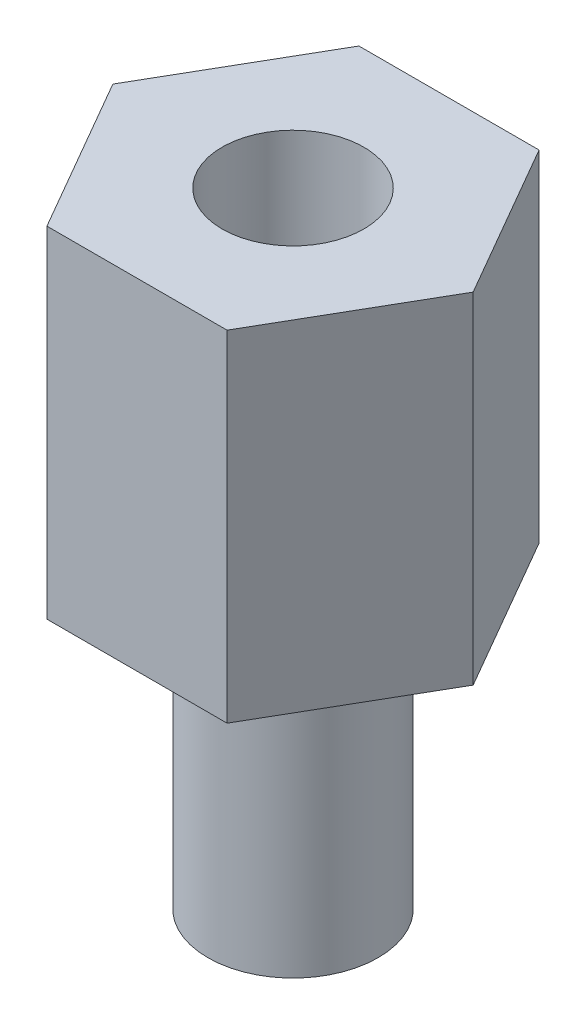
ISO-10303-21;
HEADER;
FILE_DESCRIPTION(('STEP AP214'),'2;1');
FILE_NAME('part.step','',(''),(''),'','','');
FILE_SCHEMA(('AUTOMOTIVE_DESIGN { 1 0 10303 214 1 1 1 1 }'));
ENDSEC;
DATA;
#1=APPLICATION_CONTEXT('core data for automotive mechanical design processes');
#2=APPLICATION_PROTOCOL_DEFINITION('international standard','automotive_design',2000,#1);
#3=PRODUCT_CONTEXT('',#1,'mechanical');
#4=PRODUCT('Part','Part','',(#3));
#5=PRODUCT_RELATED_PRODUCT_CATEGORY('part','',(#4));
#6=PRODUCT_DEFINITION_FORMATION('','',#4);
#7=PRODUCT_DEFINITION_CONTEXT('part definition',#1,'design');
#8=PRODUCT_DEFINITION('design','',#6,#7);
#9=PRODUCT_DEFINITION_SHAPE('','',#8);
#10=(LENGTH_UNIT() NAMED_UNIT(*) SI_UNIT(.MILLI.,.METRE.));
#11=(NAMED_UNIT(*) PLANE_ANGLE_UNIT() SI_UNIT($,.RADIAN.));
#12=(NAMED_UNIT(*) SI_UNIT($,.STERADIAN.) SOLID_ANGLE_UNIT());
#13=UNCERTAINTY_MEASURE_WITH_UNIT(LENGTH_MEASURE(1.E-05),#10,'distance_accuracy_value','');
#14=(GEOMETRIC_REPRESENTATION_CONTEXT(3) GLOBAL_UNCERTAINTY_ASSIGNED_CONTEXT((#13)) GLOBAL_UNIT_ASSIGNED_CONTEXT((#10,
#11,#12)) REPRESENTATION_CONTEXT('',''));
#15=CARTESIAN_POINT('',(0.,0.,0.));
#16=DIRECTION('',(0.,0.,1.));
#17=DIRECTION('',(1.,0.,0.));
#18=AXIS2_PLACEMENT_3D('',#15,#16,#17);
#19=CARTESIAN_POINT('',(3.17542648054294,6.,0.));
#20=DIRECTION('',(-0.866025403784439,0.,0.5));
#21=DIRECTION('',(0.5,0.,0.866025403784439));
#22=AXIS2_PLACEMENT_3D('',#19,#20,#21);
#23=PLANE('',#22);
#24=DIRECTION('',(-0.5,0.,-0.866025403784439));
#25=VECTOR('',#24,1.);
#26=CARTESIAN_POINT('',(3.17542648054294,0.,0.));
#27=LINE('',#26,#25);
#28=CARTESIAN_POINT('',(3.17542648054294,0.,0.));
#29=VERTEX_POINT('',#28);
#30=CARTESIAN_POINT('',(1.58771324027147,0.,-2.75));
#31=VERTEX_POINT('',#30);
#32=EDGE_CURVE('E125',#29,#31,#27,.T.);
#33=ORIENTED_EDGE('',*,*,#32,.T.);
#34=DIRECTION('',(0.,-1.,0.));
#35=VECTOR('',#34,1.);
#36=CARTESIAN_POINT('',(1.58771324027147,6.,-2.75));
#37=LINE('',#36,#35);
#38=CARTESIAN_POINT('',(1.58771324027147,6.,-2.75));
#39=VERTEX_POINT('',#38);
#40=EDGE_CURVE('E46',#39,#31,#37,.T.);
#41=ORIENTED_EDGE('',*,*,#40,.F.);
#42=DIRECTION('',(-0.5,0.,-0.866025403784439));
#43=VECTOR('',#42,1.);
#44=CARTESIAN_POINT('',(3.17542648054294,6.,0.));
#45=LINE('',#44,#43);
#46=CARTESIAN_POINT('',(3.17542648054294,6.,0.));
#47=VERTEX_POINT('',#46);
#48=EDGE_CURVE('E136',#47,#39,#45,.T.);
#49=ORIENTED_EDGE('',*,*,#48,.F.);
#50=DIRECTION('',(0.,-1.,0.));
#51=VECTOR('',#50,1.);
#52=CARTESIAN_POINT('',(3.17542648054294,6.,0.));
#53=LINE('',#52,#51);
#54=EDGE_CURVE('E121',#47,#29,#53,.T.);
#55=ORIENTED_EDGE('',*,*,#54,.T.);
#56=EDGE_LOOP('',(#33,#41,#49,#55));
#57=FACE_BOUND('',#56,.T.);
#58=ADVANCED_FACE('F38',(#57),#23,.F.);
#59=CARTESIAN_POINT('',(1.58771324027147,6.,-2.75));
#60=DIRECTION('',(0.,0.,1.));
#61=DIRECTION('',(1.,0.,0.));
#62=AXIS2_PLACEMENT_3D('',#59,#60,#61);
#63=PLANE('',#62);
#64=DIRECTION('',(-1.,0.,0.));
#65=VECTOR('',#64,1.);
#66=CARTESIAN_POINT('',(1.58771324027147,0.,-2.75));
#67=LINE('',#66,#65);
#68=CARTESIAN_POINT('',(-1.58771324027147,0.,-2.75));
#69=VERTEX_POINT('',#68);
#70=EDGE_CURVE('E128',#31,#69,#67,.T.);
#71=ORIENTED_EDGE('',*,*,#70,.T.);
#72=DIRECTION('',(0.,-1.,0.));
#73=VECTOR('',#72,1.);
#74=CARTESIAN_POINT('',(-1.58771324027147,6.,-2.75));
#75=LINE('',#74,#73);
#76=CARTESIAN_POINT('',(-1.58771324027147,6.,-2.75));
#77=VERTEX_POINT('',#76);
#78=EDGE_CURVE('E140',#77,#69,#75,.T.);
#79=ORIENTED_EDGE('',*,*,#78,.F.);
#80=DIRECTION('',(-1.,0.,0.));
#81=VECTOR('',#80,1.);
#82=CARTESIAN_POINT('',(1.58771324027147,6.,-2.75));
#83=LINE('',#82,#81);
#84=EDGE_CURVE('E93',#39,#77,#83,.T.);
#85=ORIENTED_EDGE('',*,*,#84,.F.);
#86=ORIENTED_EDGE('',*,*,#40,.T.);
#87=EDGE_LOOP('',(#71,#79,#85,#86));
#88=FACE_BOUND('',#87,.T.);
#89=ADVANCED_FACE('F143',(#88),#63,.F.);
#90=CARTESIAN_POINT('',(-1.58771324027147,6.,-2.75));
#91=DIRECTION('',(0.866025403784439,0.,0.5));
#92=DIRECTION('',(0.5,0.,-0.866025403784439));
#93=AXIS2_PLACEMENT_3D('',#90,#91,#92);
#94=PLANE('',#93);
#95=DIRECTION('',(-0.5,0.,0.866025403784439));
#96=VECTOR('',#95,1.);
#97=CARTESIAN_POINT('',(-1.58771324027147,0.,-2.75));
#98=LINE('',#97,#96);
#99=CARTESIAN_POINT('',(-3.17542648054294,0.,0.));
#100=VERTEX_POINT('',#99);
#101=EDGE_CURVE('E131',#69,#100,#98,.T.);
#102=ORIENTED_EDGE('',*,*,#101,.T.);
#103=DIRECTION('',(0.,-1.,0.));
#104=VECTOR('',#103,1.);
#105=CARTESIAN_POINT('',(-3.17542648054294,6.,0.));
#106=LINE('',#105,#104);
#107=CARTESIAN_POINT('',(-3.17542648054294,6.,0.));
#108=VERTEX_POINT('',#107);
#109=EDGE_CURVE('E116',#108,#100,#106,.T.);
#110=ORIENTED_EDGE('',*,*,#109,.F.);
#111=DIRECTION('',(-0.5,0.,0.866025403784439));
#112=VECTOR('',#111,1.);
#113=CARTESIAN_POINT('',(-1.58771324027147,6.,-2.75));
#114=LINE('',#113,#112);
#115=EDGE_CURVE('E107',#77,#108,#114,.T.);
#116=ORIENTED_EDGE('',*,*,#115,.F.);
#117=ORIENTED_EDGE('',*,*,#78,.T.);
#118=EDGE_LOOP('',(#102,#110,#116,#117));
#119=FACE_BOUND('',#118,.T.);
#120=ADVANCED_FACE('F151',(#119),#94,.F.);
#121=CARTESIAN_POINT('',(-3.17542648054294,6.,0.));
#122=DIRECTION('',(0.866025403784439,0.,-0.5));
#123=DIRECTION('',(-0.5,0.,-0.866025403784439));
#124=AXIS2_PLACEMENT_3D('',#121,#122,#123);
#125=PLANE('',#124);
#126=DIRECTION('',(0.5,0.,0.866025403784439));
#127=VECTOR('',#126,1.);
#128=CARTESIAN_POINT('',(-3.17542648054294,0.,0.));
#129=LINE('',#128,#127);
#130=CARTESIAN_POINT('',(-1.58771324027147,0.,2.75));
#131=VERTEX_POINT('',#130);
#132=EDGE_CURVE('E115',#100,#131,#129,.T.);
#133=ORIENTED_EDGE('',*,*,#132,.T.);
#134=DIRECTION('',(0.,-1.,0.));
#135=VECTOR('',#134,1.);
#136=CARTESIAN_POINT('',(-1.58771324027147,6.,2.75));
#137=LINE('',#136,#135);
#138=CARTESIAN_POINT('',(-1.58771324027147,6.,2.75));
#139=VERTEX_POINT('',#138);
#140=EDGE_CURVE('E112',#139,#131,#137,.T.);
#141=ORIENTED_EDGE('',*,*,#140,.F.);
#142=DIRECTION('',(0.5,0.,0.866025403784439));
#143=VECTOR('',#142,1.);
#144=CARTESIAN_POINT('',(-3.17542648054294,6.,0.));
#145=LINE('',#144,#143);
#146=EDGE_CURVE('E101',#108,#139,#145,.T.);
#147=ORIENTED_EDGE('',*,*,#146,.F.);
#148=ORIENTED_EDGE('',*,*,#109,.T.);
#149=EDGE_LOOP('',(#133,#141,#147,#148));
#150=FACE_BOUND('',#149,.T.);
#151=ADVANCED_FACE('F113',(#150),#125,.F.);
#152=CARTESIAN_POINT('',(-1.58771324027147,6.,2.75));
#153=DIRECTION('',(0.,0.,-1.));
#154=DIRECTION('',(-1.,0.,0.));
#155=AXIS2_PLACEMENT_3D('',#152,#153,#154);
#156=PLANE('',#155);
#157=DIRECTION('',(1.,0.,0.));
#158=VECTOR('',#157,1.);
#159=CARTESIAN_POINT('',(-1.58771324027147,0.,2.75));
#160=LINE('',#159,#158);
#161=CARTESIAN_POINT('',(1.58771324027147,0.,2.75));
#162=VERTEX_POINT('',#161);
#163=EDGE_CURVE('E78',#131,#162,#160,.T.);
#164=ORIENTED_EDGE('',*,*,#163,.T.);
#165=DIRECTION('',(0.,-1.,0.));
#166=VECTOR('',#165,1.);
#167=CARTESIAN_POINT('',(1.58771324027147,6.,2.75));
#168=LINE('',#167,#166);
#169=CARTESIAN_POINT('',(1.58771324027147,6.,2.75));
#170=VERTEX_POINT('',#169);
#171=EDGE_CURVE('E117',#170,#162,#168,.T.);
#172=ORIENTED_EDGE('',*,*,#171,.F.);
#173=DIRECTION('',(1.,0.,0.));
#174=VECTOR('',#173,1.);
#175=CARTESIAN_POINT('',(-1.58771324027147,6.,2.75));
#176=LINE('',#175,#174);
#177=EDGE_CURVE('E105',#139,#170,#176,.T.);
#178=ORIENTED_EDGE('',*,*,#177,.F.);
#179=ORIENTED_EDGE('',*,*,#140,.T.);
#180=EDGE_LOOP('',(#164,#172,#178,#179));
#181=FACE_BOUND('',#180,.T.);
#182=ADVANCED_FACE('F119',(#181),#156,.F.);
#183=CARTESIAN_POINT('',(1.58771324027147,6.,2.75));
#184=DIRECTION('',(-0.866025403784439,0.,-0.5));
#185=DIRECTION('',(-0.5,0.,0.866025403784439));
#186=AXIS2_PLACEMENT_3D('',#183,#184,#185);
#187=PLANE('',#186);
#188=DIRECTION('',(0.5,0.,-0.866025403784439));
#189=VECTOR('',#188,1.);
#190=CARTESIAN_POINT('',(1.58771324027147,0.,2.75));
#191=LINE('',#190,#189);
#192=EDGE_CURVE('E84',#162,#29,#191,.T.);
#193=ORIENTED_EDGE('',*,*,#192,.T.);
#194=ORIENTED_EDGE('',*,*,#54,.F.);
#195=DIRECTION('',(0.5,0.,-0.866025403784439));
#196=VECTOR('',#195,1.);
#197=CARTESIAN_POINT('',(1.58771324027147,6.,2.75));
#198=LINE('',#197,#196);
#199=EDGE_CURVE('E54',#170,#47,#198,.T.);
#200=ORIENTED_EDGE('',*,*,#199,.F.);
#201=ORIENTED_EDGE('',*,*,#171,.T.);
#202=EDGE_LOOP('',(#193,#194,#200,#201));
#203=FACE_BOUND('',#202,.T.);
#204=ADVANCED_FACE('F167',(#203),#187,.F.);
#205=CARTESIAN_POINT('',(0.,6.,0.));
#206=DIRECTION('',(0.,1.,0.));
#207=DIRECTION('',(0.,0.,1.));
#208=AXIS2_PLACEMENT_3D('',#205,#206,#207);
#209=PLANE('',#208);
#210=CARTESIAN_POINT('',(0.,6.,0.));
#211=DIRECTION('',(0.,1.,0.));
#212=DIRECTION('',(0.,0.,1.));
#213=AXIS2_PLACEMENT_3D('',#210,#211,#212);
#214=CIRCLE('',#213,1.24999999999999);
#215=CARTESIAN_POINT('',(0.,6.,1.24999999999999));
#216=VERTEX_POINT('',#215);
#217=EDGE_CURVE('E160',#216,#216,#214,.T.);
#218=ORIENTED_EDGE('',*,*,#217,.F.);
#219=EDGE_LOOP('',(#218));
#220=FACE_BOUND('',#219,.T.);
#221=ORIENTED_EDGE('',*,*,#48,.T.);
#222=ORIENTED_EDGE('',*,*,#84,.T.);
#223=ORIENTED_EDGE('',*,*,#115,.T.);
#224=ORIENTED_EDGE('',*,*,#146,.T.);
#225=ORIENTED_EDGE('',*,*,#177,.T.);
#226=ORIENTED_EDGE('',*,*,#199,.T.);
#227=EDGE_LOOP('',(#221,#222,#223,#224,#225,#226));
#228=FACE_BOUND('',#227,.T.);
#229=ADVANCED_FACE('F103',(#220,#228),#209,.T.);
#230=CARTESIAN_POINT('',(0.,0.,0.));
#231=DIRECTION('',(0.,1.,0.));
#232=DIRECTION('',(0.,0.,1.));
#233=AXIS2_PLACEMENT_3D('',#230,#231,#232);
#234=PLANE('',#233);
#235=CARTESIAN_POINT('',(0.,0.,0.));
#236=DIRECTION('',(0.,1.,0.));
#237=DIRECTION('',(0.,0.,1.));
#238=AXIS2_PLACEMENT_3D('',#235,#236,#237);
#239=CIRCLE('',#238,1.5);
#240=CARTESIAN_POINT('',(0.,0.,1.5));
#241=VERTEX_POINT('',#240);
#242=EDGE_CURVE('E11',#241,#241,#239,.F.);
#243=ORIENTED_EDGE('',*,*,#242,.F.);
#244=EDGE_LOOP('',(#243));
#245=FACE_BOUND('',#244,.T.);
#246=ORIENTED_EDGE('',*,*,#32,.F.);
#247=ORIENTED_EDGE('',*,*,#192,.F.);
#248=ORIENTED_EDGE('',*,*,#163,.F.);
#249=ORIENTED_EDGE('',*,*,#132,.F.);
#250=ORIENTED_EDGE('',*,*,#101,.F.);
#251=ORIENTED_EDGE('',*,*,#70,.F.);
#252=EDGE_LOOP('',(#246,#247,#248,#249,#250,#251));
#253=FACE_BOUND('',#252,.T.);
#254=ADVANCED_FACE('F148',(#245,#253),#234,.F.);
#255=CARTESIAN_POINT('',(0.,-5.,0.));
#256=DIRECTION('',(0.,1.,0.));
#257=DIRECTION('',(0.,0.,1.));
#258=AXIS2_PLACEMENT_3D('',#255,#256,#257);
#259=CYLINDRICAL_SURFACE('',#258,1.5);
#260=CARTESIAN_POINT('',(0.,-5.,0.));
#261=DIRECTION('',(0.,-1.,0.));
#262=DIRECTION('',(0.,0.,-1.));
#263=AXIS2_PLACEMENT_3D('',#260,#261,#262);
#264=CIRCLE('',#263,1.5);
#265=CARTESIAN_POINT('',(0.,-5.,-1.5));
#266=VERTEX_POINT('',#265);
#267=EDGE_CURVE('E129',#266,#266,#264,.T.);
#268=ORIENTED_EDGE('',*,*,#267,.F.);
#269=EDGE_LOOP('',(#268));
#270=FACE_BOUND('',#269,.T.);
#271=ORIENTED_EDGE('',*,*,#242,.T.);
#272=EDGE_LOOP('',(#271));
#273=FACE_BOUND('',#272,.T.);
#274=ADVANCED_FACE('F173',(#270,#273),#259,.T.);
#275=CARTESIAN_POINT('',(0.,-5.,0.));
#276=DIRECTION('',(0.,-1.,0.));
#277=DIRECTION('',(0.,0.,-1.));
#278=AXIS2_PLACEMENT_3D('',#275,#276,#277);
#279=PLANE('',#278);
#280=ORIENTED_EDGE('',*,*,#267,.T.);
#281=EDGE_LOOP('',(#280));
#282=FACE_BOUND('',#281,.T.);
#283=ADVANCED_FACE('F214',(#282),#279,.T.);
#284=CARTESIAN_POINT('',(0.,0.5,0.));
#285=DIRECTION('',(0.,1.,0.));
#286=DIRECTION('',(0.,0.,1.));
#287=AXIS2_PLACEMENT_3D('',#284,#285,#286);
#288=CONICAL_SURFACE('',#287,1.25,1.02974425867665);
#289=CARTESIAN_POINT('',(0.,-0.251075773784451,0.));
#290=VERTEX_POINT('',#289);
#291=VERTEX_LOOP('',#290);
#292=FACE_BOUND('',#291,.T.);
#293=CARTESIAN_POINT('',(0.,0.5,0.));
#294=DIRECTION('',(0.,1.,0.));
#295=DIRECTION('',(0.,0.,1.));
#296=AXIS2_PLACEMENT_3D('',#293,#294,#295);
#297=CIRCLE('',#296,1.25);
#298=CARTESIAN_POINT('',(0.,0.5,1.25));
#299=VERTEX_POINT('',#298);
#300=EDGE_CURVE('E157',#299,#299,#297,.T.);
#301=ORIENTED_EDGE('',*,*,#300,.T.);
#302=EDGE_LOOP('',(#301));
#303=FACE_BOUND('',#302,.T.);
#304=ADVANCED_FACE('F222',(#292,#303),#288,.F.);
#305=CARTESIAN_POINT('',(0.,6.,0.));
#306=DIRECTION('',(0.,1.,0.));
#307=DIRECTION('',(0.,0.,1.));
#308=AXIS2_PLACEMENT_3D('',#305,#306,#307);
#309=CYLINDRICAL_SURFACE('',#308,1.24999999999999);
#310=ORIENTED_EDGE('',*,*,#300,.F.);
#311=EDGE_LOOP('',(#310));
#312=FACE_BOUND('',#311,.T.);
#313=ORIENTED_EDGE('',*,*,#217,.T.);
#314=EDGE_LOOP('',(#313));
#315=FACE_BOUND('',#314,.T.);
#316=ADVANCED_FACE('F164',(#312,#315),#309,.F.);
#317=CLOSED_SHELL('',(#58,#89,#120,#151,#182,#204,#229,#254,#274,#283,#304,#316));
#318=MANIFOLD_SOLID_BREP('B2',#317);
#319=ADVANCED_BREP_SHAPE_REPRESENTATION('',(#18,#318),#14);
#320=SHAPE_DEFINITION_REPRESENTATION(#9,#319);
ENDSEC;
END-ISO-10303-21;
